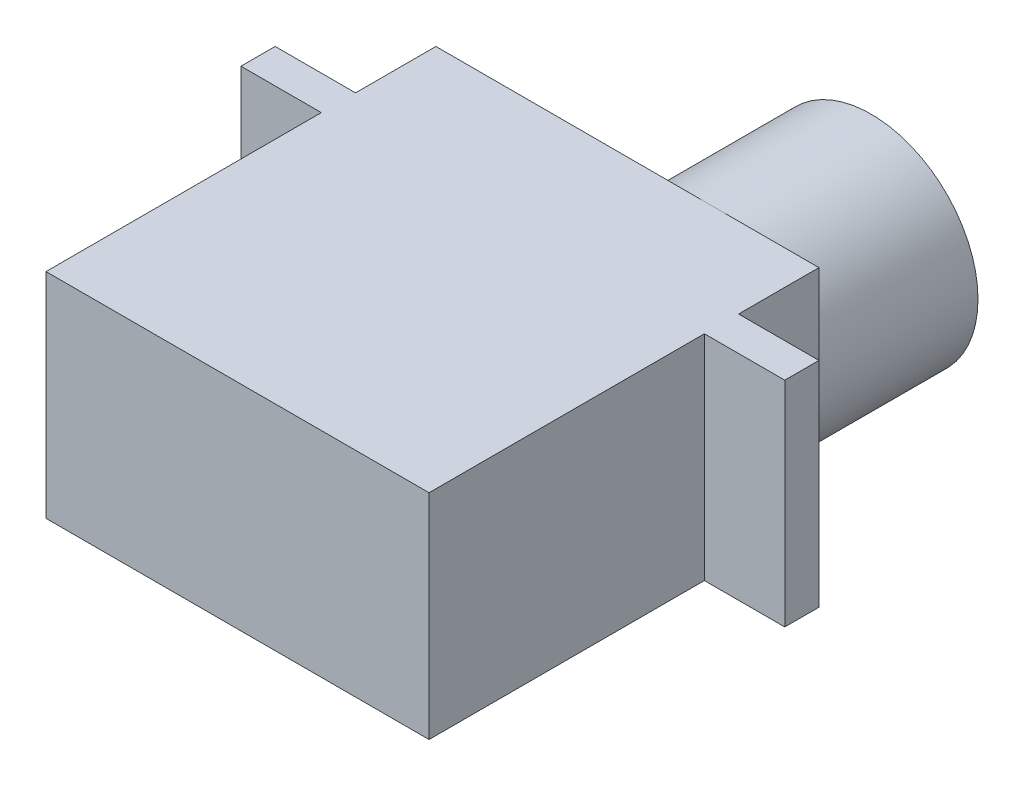
ISO-10303-21;
HEADER;
FILE_DESCRIPTION(('STEP AP214'),'2;1');
FILE_NAME('part.step','',(''),(''),'','','');
FILE_SCHEMA(('AUTOMOTIVE_DESIGN { 1 0 10303 214 1 1 1 1 }'));
ENDSEC;
DATA;
#1=APPLICATION_CONTEXT('core data for automotive mechanical design processes');
#2=APPLICATION_PROTOCOL_DEFINITION('international standard','automotive_design',2000,#1);
#3=PRODUCT_CONTEXT('',#1,'mechanical');
#4=PRODUCT('Part','Part','',(#3));
#5=PRODUCT_RELATED_PRODUCT_CATEGORY('part','',(#4));
#6=PRODUCT_DEFINITION_FORMATION('','',#4);
#7=PRODUCT_DEFINITION_CONTEXT('part definition',#1,'design');
#8=PRODUCT_DEFINITION('design','',#6,#7);
#9=PRODUCT_DEFINITION_SHAPE('','',#8);
#10=(LENGTH_UNIT() NAMED_UNIT(*) SI_UNIT(.MILLI.,.METRE.));
#11=(NAMED_UNIT(*) PLANE_ANGLE_UNIT() SI_UNIT($,.RADIAN.));
#12=(NAMED_UNIT(*) SI_UNIT($,.STERADIAN.) SOLID_ANGLE_UNIT());
#13=UNCERTAINTY_MEASURE_WITH_UNIT(LENGTH_MEASURE(1.E-05),#10,'distance_accuracy_value','');
#14=(GEOMETRIC_REPRESENTATION_CONTEXT(3) GLOBAL_UNCERTAINTY_ASSIGNED_CONTEXT((#13)) GLOBAL_UNIT_ASSIGNED_CONTEXT((#10,
#11,#12)) REPRESENTATION_CONTEXT('',''));
#15=CARTESIAN_POINT('',(0.,0.,0.));
#16=DIRECTION('',(0.,0.,1.));
#17=DIRECTION('',(1.,0.,0.));
#18=AXIS2_PLACEMENT_3D('',#15,#16,#17);
#19=CARTESIAN_POINT('',(0.,0.,-6.7));
#20=DIRECTION('',(0.,0.,-1.));
#21=DIRECTION('',(-1.,0.,0.));
#22=AXIS2_PLACEMENT_3D('',#19,#20,#21);
#23=PLANE('',#22);
#24=CARTESIAN_POINT('',(4.95,0.,-6.7));
#25=DIRECTION('',(0.,0.,-1.));
#26=DIRECTION('',(-1.,0.,0.));
#27=AXIS2_PLACEMENT_3D('',#24,#25,#26);
#28=CIRCLE('',#27,6.25);
#29=CARTESIAN_POINT('',(4.95,6.25,-6.7));
#30=VERTEX_POINT('',#29);
#31=CARTESIAN_POINT('',(11.2,0.,-6.7));
#32=VERTEX_POINT('',#31);
#33=EDGE_CURVE('E51',#30,#32,#28,.T.);
#34=ORIENTED_EDGE('',*,*,#33,.F.);
#35=DIRECTION('',(1.,0.,0.));
#36=VECTOR('',#35,1.);
#37=CARTESIAN_POINT('',(-11.2,6.25,-6.7));
#38=LINE('',#37,#36);
#39=CARTESIAN_POINT('',(11.2,6.25,-6.7));
#40=VERTEX_POINT('',#39);
#41=EDGE_CURVE('E147',#30,#40,#38,.T.);
#42=ORIENTED_EDGE('',*,*,#41,.T.);
#43=DIRECTION('',(0.,-1.,0.));
#44=VECTOR('',#43,1.);
#45=CARTESIAN_POINT('',(11.2,6.25,-6.7));
#46=LINE('',#45,#44);
#47=EDGE_CURVE('E162',#40,#32,#46,.T.);
#48=ORIENTED_EDGE('',*,*,#47,.T.);
#49=EDGE_LOOP('',(#34,#42,#48));
#50=FACE_BOUND('',#49,.T.);
#51=ADVANCED_FACE('F39',(#50),#23,.T.);
#52=CARTESIAN_POINT('',(4.95,-6.25,-6.7));
#53=VERTEX_POINT('',#52);
#54=EDGE_CURVE('E11',#32,#53,#28,.T.);
#55=ORIENTED_EDGE('',*,*,#54,.F.);
#56=CARTESIAN_POINT('',(11.2,-6.25,-6.7));
#57=VERTEX_POINT('',#56);
#58=EDGE_CURVE('E146',#32,#57,#46,.T.);
#59=ORIENTED_EDGE('',*,*,#58,.T.);
#60=DIRECTION('',(-1.,0.,0.));
#61=VECTOR('',#60,1.);
#62=CARTESIAN_POINT('',(11.2,-6.25,-6.7));
#63=LINE('',#62,#61);
#64=EDGE_CURVE('E178',#57,#53,#63,.T.);
#65=ORIENTED_EDGE('',*,*,#64,.T.);
#66=EDGE_LOOP('',(#55,#59,#65));
#67=FACE_BOUND('',#66,.T.);
#68=ADVANCED_FACE('F320',(#67),#23,.T.);
#69=CARTESIAN_POINT('',(0.,0.,-2.));
#70=DIRECTION('',(0.,0.,1.));
#71=DIRECTION('',(1.,0.,0.));
#72=AXIS2_PLACEMENT_3D('',#69,#70,#71);
#73=PLANE('',#72);
#74=DIRECTION('',(0.,1.,0.));
#75=VECTOR('',#74,1.);
#76=CARTESIAN_POINT('',(-11.2,-6.25,-2.));
#77=LINE('',#76,#75);
#78=CARTESIAN_POINT('',(-11.2,-6.25,-2.));
#79=VERTEX_POINT('',#78);
#80=CARTESIAN_POINT('',(-11.2,6.25,-2.));
#81=VERTEX_POINT('',#80);
#82=EDGE_CURVE('E160',#79,#81,#77,.T.);
#83=ORIENTED_EDGE('',*,*,#82,.F.);
#84=DIRECTION('',(-1.,0.,0.));
#85=VECTOR('',#84,1.);
#86=CARTESIAN_POINT('',(-15.9,-6.25,-2.));
#87=LINE('',#86,#85);
#88=CARTESIAN_POINT('',(-15.9,-6.25,-2.));
#89=VERTEX_POINT('',#88);
#90=EDGE_CURVE('E208',#79,#89,#87,.T.);
#91=ORIENTED_EDGE('',*,*,#90,.T.);
#92=DIRECTION('',(0.,1.,0.));
#93=VECTOR('',#92,1.);
#94=CARTESIAN_POINT('',(-15.9,6.25,-2.));
#95=LINE('',#94,#93);
#96=CARTESIAN_POINT('',(-15.9,6.25,-2.));
#97=VERTEX_POINT('',#96);
#98=EDGE_CURVE('E213',#89,#97,#95,.T.);
#99=ORIENTED_EDGE('',*,*,#98,.T.);
#100=DIRECTION('',(1.,0.,0.));
#101=VECTOR('',#100,1.);
#102=CARTESIAN_POINT('',(-15.9,6.25,-2.));
#103=LINE('',#102,#101);
#104=EDGE_CURVE('E217',#97,#81,#103,.T.);
#105=ORIENTED_EDGE('',*,*,#104,.T.);
#106=EDGE_LOOP('',(#83,#91,#99,#105));
#107=FACE_BOUND('',#106,.T.);
#108=ADVANCED_FACE('F325',(#107),#73,.F.);
#109=DIRECTION('',(0.,-1.,0.));
#110=VECTOR('',#109,1.);
#111=CARTESIAN_POINT('',(11.2,6.25,-2.));
#112=LINE('',#111,#110);
#113=CARTESIAN_POINT('',(11.2,6.25,-2.));
#114=VERTEX_POINT('',#113);
#115=CARTESIAN_POINT('',(11.2,-6.25,-2.));
#116=VERTEX_POINT('',#115);
#117=EDGE_CURVE('E184',#114,#116,#112,.T.);
#118=ORIENTED_EDGE('',*,*,#117,.F.);
#119=CARTESIAN_POINT('',(15.9,6.25,-2.));
#120=VERTEX_POINT('',#119);
#121=EDGE_CURVE('E216',#114,#120,#103,.T.);
#122=ORIENTED_EDGE('',*,*,#121,.T.);
#123=DIRECTION('',(0.,-1.,0.));
#124=VECTOR('',#123,1.);
#125=CARTESIAN_POINT('',(15.9,6.25,-2.));
#126=LINE('',#125,#124);
#127=CARTESIAN_POINT('',(15.9,-6.25,-2.));
#128=VERTEX_POINT('',#127);
#129=EDGE_CURVE('E204',#120,#128,#126,.T.);
#130=ORIENTED_EDGE('',*,*,#129,.T.);
#131=EDGE_CURVE('E210',#128,#116,#87,.T.);
#132=ORIENTED_EDGE('',*,*,#131,.T.);
#133=EDGE_LOOP('',(#118,#122,#130,#132));
#134=FACE_BOUND('',#133,.T.);
#135=ADVANCED_FACE('F337',(#134),#73,.F.);
#136=CARTESIAN_POINT('',(-11.2,-6.25,16.1));
#137=DIRECTION('',(-1.,0.,0.));
#138=DIRECTION('',(0.,0.,1.));
#139=AXIS2_PLACEMENT_3D('',#136,#137,#138);
#140=PLANE('',#139);
#141=DIRECTION('',(0.,1.,0.));
#142=VECTOR('',#141,1.);
#143=CARTESIAN_POINT('',(-11.2,-6.25,0.));
#144=LINE('',#143,#142);
#145=CARTESIAN_POINT('',(-11.2,-6.25,0.));
#146=VERTEX_POINT('',#145);
#147=CARTESIAN_POINT('',(-11.2,6.25,0.));
#148=VERTEX_POINT('',#147);
#149=EDGE_CURVE('E251',#146,#148,#144,.T.);
#150=ORIENTED_EDGE('',*,*,#149,.F.);
#151=DIRECTION('',(0.,0.,-1.));
#152=VECTOR('',#151,1.);
#153=CARTESIAN_POINT('',(-11.2,-6.25,16.1));
#154=LINE('',#153,#152);
#155=CARTESIAN_POINT('',(-11.2,-6.25,16.1));
#156=VERTEX_POINT('',#155);
#157=EDGE_CURVE('E168',#156,#146,#154,.T.);
#158=ORIENTED_EDGE('',*,*,#157,.F.);
#159=DIRECTION('',(0.,1.,0.));
#160=VECTOR('',#159,1.);
#161=CARTESIAN_POINT('',(-11.2,-6.25,16.1));
#162=LINE('',#161,#160);
#163=CARTESIAN_POINT('',(-11.2,6.25,16.1));
#164=VERTEX_POINT('',#163);
#165=EDGE_CURVE('E252',#156,#164,#162,.T.);
#166=ORIENTED_EDGE('',*,*,#165,.T.);
#167=DIRECTION('',(0.,0.,-1.));
#168=VECTOR('',#167,1.);
#169=CARTESIAN_POINT('',(-11.2,6.25,16.1));
#170=LINE('',#169,#168);
#171=EDGE_CURVE('E43',#164,#148,#170,.T.);
#172=ORIENTED_EDGE('',*,*,#171,.T.);
#173=EDGE_LOOP('',(#150,#158,#166,#172));
#174=FACE_BOUND('',#173,.T.);
#175=ADVANCED_FACE('F41',(#174),#140,.T.);
#176=CARTESIAN_POINT('',(-11.2,-6.25,16.1));
#177=DIRECTION('',(0.,1.,0.));
#178=DIRECTION('',(0.,0.,1.));
#179=AXIS2_PLACEMENT_3D('',#176,#177,#178);
#180=PLANE('',#179);
#181=ORIENTED_EDGE('',*,*,#157,.T.);
#182=DIRECTION('',(-1.,0.,0.));
#183=VECTOR('',#182,1.);
#184=CARTESIAN_POINT('',(-15.9,-6.25,0.));
#185=LINE('',#184,#183);
#186=CARTESIAN_POINT('',(-15.9,-6.25,0.));
#187=VERTEX_POINT('',#186);
#188=EDGE_CURVE('E224',#146,#187,#185,.T.);
#189=ORIENTED_EDGE('',*,*,#188,.T.);
#190=DIRECTION('',(0.,0.,1.));
#191=VECTOR('',#190,1.);
#192=CARTESIAN_POINT('',(-15.9,-6.25,-2.));
#193=LINE('',#192,#191);
#194=EDGE_CURVE('E243',#89,#187,#193,.T.);
#195=ORIENTED_EDGE('',*,*,#194,.F.);
#196=ORIENTED_EDGE('',*,*,#90,.F.);
#197=DIRECTION('',(0.,0.,1.));
#198=VECTOR('',#197,1.);
#199=CARTESIAN_POINT('',(-11.2,-6.25,-6.7));
#200=LINE('',#199,#198);
#201=CARTESIAN_POINT('',(-11.2,-6.25,-6.7));
#202=VERTEX_POINT('',#201);
#203=EDGE_CURVE('E193',#202,#79,#200,.T.);
#204=ORIENTED_EDGE('',*,*,#203,.F.);
#205=EDGE_CURVE('E177',#53,#202,#63,.T.);
#206=ORIENTED_EDGE('',*,*,#205,.F.);
#207=ORIENTED_EDGE('',*,*,#64,.F.);
#208=DIRECTION('',(0.,0.,1.));
#209=VECTOR('',#208,1.);
#210=CARTESIAN_POINT('',(11.2,-6.25,-6.7));
#211=LINE('',#210,#209);
#212=EDGE_CURVE('E197',#57,#116,#211,.T.);
#213=ORIENTED_EDGE('',*,*,#212,.T.);
#214=ORIENTED_EDGE('',*,*,#131,.F.);
#215=DIRECTION('',(0.,0.,1.));
#216=VECTOR('',#215,1.);
#217=CARTESIAN_POINT('',(15.9,-6.25,-2.));
#218=LINE('',#217,#216);
#219=CARTESIAN_POINT('',(15.9,-6.25,0.));
#220=VERTEX_POINT('',#219);
#221=EDGE_CURVE('E247',#128,#220,#218,.T.);
#222=ORIENTED_EDGE('',*,*,#221,.T.);
#223=CARTESIAN_POINT('',(11.2,-6.25,0.));
#224=VERTEX_POINT('',#223);
#225=EDGE_CURVE('E225',#220,#224,#185,.T.);
#226=ORIENTED_EDGE('',*,*,#225,.T.);
#227=DIRECTION('',(0.,0.,-1.));
#228=VECTOR('',#227,1.);
#229=CARTESIAN_POINT('',(11.2,-6.25,16.1));
#230=LINE('',#229,#228);
#231=CARTESIAN_POINT('',(11.2,-6.25,16.1));
#232=VERTEX_POINT('',#231);
#233=EDGE_CURVE('E171',#232,#224,#230,.T.);
#234=ORIENTED_EDGE('',*,*,#233,.F.);
#235=DIRECTION('',(1.,0.,0.));
#236=VECTOR('',#235,1.);
#237=CARTESIAN_POINT('',(-11.2,-6.25,16.1));
#238=LINE('',#237,#236);
#239=EDGE_CURVE('E264',#156,#232,#238,.T.);
#240=ORIENTED_EDGE('',*,*,#239,.F.);
#241=EDGE_LOOP('',(#181,#189,#195,#196,#204,#206,#207,#213,#214,#222,#226,#234,#240));
#242=FACE_BOUND('',#241,.T.);
#243=ADVANCED_FACE('F295',(#242),#180,.F.);
#244=CARTESIAN_POINT('',(11.2,-6.25,16.1));
#245=DIRECTION('',(-1.,0.,0.));
#246=DIRECTION('',(0.,0.,1.));
#247=AXIS2_PLACEMENT_3D('',#244,#245,#246);
#248=PLANE('',#247);
#249=DIRECTION('',(0.,1.,0.));
#250=VECTOR('',#249,1.);
#251=CARTESIAN_POINT('',(11.2,-6.25,0.));
#252=LINE('',#251,#250);
#253=CARTESIAN_POINT('',(11.2,6.25,0.));
#254=VERTEX_POINT('',#253);
#255=EDGE_CURVE('E257',#224,#254,#252,.T.);
#256=ORIENTED_EDGE('',*,*,#255,.T.);
#257=DIRECTION('',(0.,0.,-1.));
#258=VECTOR('',#257,1.);
#259=CARTESIAN_POINT('',(11.2,6.25,16.1));
#260=LINE('',#259,#258);
#261=CARTESIAN_POINT('',(11.2,6.25,16.1));
#262=VERTEX_POINT('',#261);
#263=EDGE_CURVE('E274',#262,#254,#260,.T.);
#264=ORIENTED_EDGE('',*,*,#263,.F.);
#265=DIRECTION('',(0.,1.,0.));
#266=VECTOR('',#265,1.);
#267=CARTESIAN_POINT('',(11.2,-6.25,16.1));
#268=LINE('',#267,#266);
#269=EDGE_CURVE('E261',#232,#262,#268,.T.);
#270=ORIENTED_EDGE('',*,*,#269,.F.);
#271=ORIENTED_EDGE('',*,*,#233,.T.);
#272=EDGE_LOOP('',(#256,#264,#270,#271));
#273=FACE_BOUND('',#272,.T.);
#274=ADVANCED_FACE('F290',(#273),#248,.F.);
#275=CARTESIAN_POINT('',(-11.2,6.25,16.1));
#276=DIRECTION('',(0.,1.,0.));
#277=DIRECTION('',(0.,0.,1.));
#278=AXIS2_PLACEMENT_3D('',#275,#276,#277);
#279=PLANE('',#278);
#280=ORIENTED_EDGE('',*,*,#263,.T.);
#281=DIRECTION('',(1.,0.,0.));
#282=VECTOR('',#281,1.);
#283=CARTESIAN_POINT('',(-15.9,6.25,0.));
#284=LINE('',#283,#282);
#285=CARTESIAN_POINT('',(15.9,6.25,0.));
#286=VERTEX_POINT('',#285);
#287=EDGE_CURVE('E232',#254,#286,#284,.T.);
#288=ORIENTED_EDGE('',*,*,#287,.T.);
#289=DIRECTION('',(0.,0.,1.));
#290=VECTOR('',#289,1.);
#291=CARTESIAN_POINT('',(15.9,6.25,-2.));
#292=LINE('',#291,#290);
#293=EDGE_CURVE('E220',#120,#286,#292,.T.);
#294=ORIENTED_EDGE('',*,*,#293,.F.);
#295=ORIENTED_EDGE('',*,*,#121,.F.);
#296=DIRECTION('',(0.,0.,1.));
#297=VECTOR('',#296,1.);
#298=CARTESIAN_POINT('',(11.2,6.25,-6.7));
#299=LINE('',#298,#297);
#300=EDGE_CURVE('E155',#40,#114,#299,.T.);
#301=ORIENTED_EDGE('',*,*,#300,.F.);
#302=ORIENTED_EDGE('',*,*,#41,.F.);
#303=CARTESIAN_POINT('',(-11.2,6.25,-6.7));
#304=VERTEX_POINT('',#303);
#305=EDGE_CURVE('E137',#304,#30,#38,.T.);
#306=ORIENTED_EDGE('',*,*,#305,.F.);
#307=DIRECTION('',(0.,0.,1.));
#308=VECTOR('',#307,1.);
#309=CARTESIAN_POINT('',(-11.2,6.25,-6.7));
#310=LINE('',#309,#308);
#311=EDGE_CURVE('E183',#304,#81,#310,.T.);
#312=ORIENTED_EDGE('',*,*,#311,.T.);
#313=ORIENTED_EDGE('',*,*,#104,.F.);
#314=DIRECTION('',(0.,0.,1.));
#315=VECTOR('',#314,1.);
#316=CARTESIAN_POINT('',(-15.9,6.25,-2.));
#317=LINE('',#316,#315);
#318=CARTESIAN_POINT('',(-15.9,6.25,0.));
#319=VERTEX_POINT('',#318);
#320=EDGE_CURVE('E239',#97,#319,#317,.T.);
#321=ORIENTED_EDGE('',*,*,#320,.T.);
#322=EDGE_CURVE('E209',#319,#148,#284,.T.);
#323=ORIENTED_EDGE('',*,*,#322,.T.);
#324=ORIENTED_EDGE('',*,*,#171,.F.);
#325=DIRECTION('',(1.,0.,0.));
#326=VECTOR('',#325,1.);
#327=CARTESIAN_POINT('',(-11.2,6.25,16.1));
#328=LINE('',#327,#326);
#329=EDGE_CURVE('E256',#164,#262,#328,.T.);
#330=ORIENTED_EDGE('',*,*,#329,.T.);
#331=EDGE_LOOP('',(#280,#288,#294,#295,#301,#302,#306,#312,#313,#321,#323,#324,#330));
#332=FACE_BOUND('',#331,.T.);
#333=ADVANCED_FACE('F152',(#332),#279,.T.);
#334=CARTESIAN_POINT('',(0.,0.,16.1));
#335=DIRECTION('',(0.,0.,-1.));
#336=DIRECTION('',(-1.,0.,0.));
#337=AXIS2_PLACEMENT_3D('',#334,#335,#336);
#338=PLANE('',#337);
#339=ORIENTED_EDGE('',*,*,#165,.F.);
#340=ORIENTED_EDGE('',*,*,#239,.T.);
#341=ORIENTED_EDGE('',*,*,#269,.T.);
#342=ORIENTED_EDGE('',*,*,#329,.F.);
#343=EDGE_LOOP('',(#339,#340,#341,#342));
#344=FACE_BOUND('',#343,.T.);
#345=ADVANCED_FACE('F285',(#344),#338,.F.);
#346=CARTESIAN_POINT('',(0.,0.,0.));
#347=DIRECTION('',(0.,0.,1.));
#348=DIRECTION('',(1.,0.,0.));
#349=AXIS2_PLACEMENT_3D('',#346,#347,#348);
#350=PLANE('',#349);
#351=ORIENTED_EDGE('',*,*,#255,.F.);
#352=ORIENTED_EDGE('',*,*,#225,.F.);
#353=DIRECTION('',(0.,-1.,0.));
#354=VECTOR('',#353,1.);
#355=CARTESIAN_POINT('',(15.9,6.25,0.));
#356=LINE('',#355,#354);
#357=EDGE_CURVE('E203',#286,#220,#356,.T.);
#358=ORIENTED_EDGE('',*,*,#357,.F.);
#359=ORIENTED_EDGE('',*,*,#287,.F.);
#360=EDGE_LOOP('',(#351,#352,#358,#359));
#361=FACE_BOUND('',#360,.T.);
#362=ADVANCED_FACE('F292',(#361),#350,.T.);
#363=CARTESIAN_POINT('',(15.9,6.25,-2.));
#364=DIRECTION('',(-1.,0.,0.));
#365=DIRECTION('',(0.,-1.,0.));
#366=AXIS2_PLACEMENT_3D('',#363,#364,#365);
#367=PLANE('',#366);
#368=ORIENTED_EDGE('',*,*,#357,.T.);
#369=ORIENTED_EDGE('',*,*,#221,.F.);
#370=ORIENTED_EDGE('',*,*,#129,.F.);
#371=ORIENTED_EDGE('',*,*,#293,.T.);
#372=EDGE_LOOP('',(#368,#369,#370,#371));
#373=FACE_BOUND('',#372,.T.);
#374=ADVANCED_FACE('F299',(#373),#367,.F.);
#375=CARTESIAN_POINT('',(-15.9,6.25,-2.));
#376=DIRECTION('',(1.,0.,0.));
#377=DIRECTION('',(0.,1.,0.));
#378=AXIS2_PLACEMENT_3D('',#375,#376,#377);
#379=PLANE('',#378);
#380=DIRECTION('',(0.,1.,0.));
#381=VECTOR('',#380,1.);
#382=CARTESIAN_POINT('',(-15.9,6.25,0.));
#383=LINE('',#382,#381);
#384=EDGE_CURVE('E229',#187,#319,#383,.T.);
#385=ORIENTED_EDGE('',*,*,#384,.T.);
#386=ORIENTED_EDGE('',*,*,#320,.F.);
#387=ORIENTED_EDGE('',*,*,#98,.F.);
#388=ORIENTED_EDGE('',*,*,#194,.T.);
#389=EDGE_LOOP('',(#385,#386,#387,#388));
#390=FACE_BOUND('',#389,.T.);
#391=ADVANCED_FACE('F341',(#390),#379,.F.);
#392=ORIENTED_EDGE('',*,*,#188,.F.);
#393=ORIENTED_EDGE('',*,*,#149,.T.);
#394=ORIENTED_EDGE('',*,*,#322,.F.);
#395=ORIENTED_EDGE('',*,*,#384,.F.);
#396=EDGE_LOOP('',(#392,#393,#394,#395));
#397=FACE_BOUND('',#396,.T.);
#398=ADVANCED_FACE('F333',(#397),#350,.T.);
#399=CARTESIAN_POINT('',(11.2,6.25,-6.7));
#400=DIRECTION('',(-1.,0.,0.));
#401=DIRECTION('',(0.,0.,1.));
#402=AXIS2_PLACEMENT_3D('',#399,#400,#401);
#403=PLANE('',#402);
#404=ORIENTED_EDGE('',*,*,#117,.T.);
#405=ORIENTED_EDGE('',*,*,#212,.F.);
#406=ORIENTED_EDGE('',*,*,#58,.F.);
#407=ORIENTED_EDGE('',*,*,#47,.F.);
#408=ORIENTED_EDGE('',*,*,#300,.T.);
#409=EDGE_LOOP('',(#404,#405,#406,#407,#408));
#410=FACE_BOUND('',#409,.T.);
#411=ADVANCED_FACE('F329',(#410),#403,.F.);
#412=CARTESIAN_POINT('',(-11.2,-6.25,-6.7));
#413=DIRECTION('',(1.,0.,0.));
#414=DIRECTION('',(0.,0.,-1.));
#415=AXIS2_PLACEMENT_3D('',#412,#413,#414);
#416=PLANE('',#415);
#417=ORIENTED_EDGE('',*,*,#82,.T.);
#418=ORIENTED_EDGE('',*,*,#311,.F.);
#419=DIRECTION('',(0.,1.,0.));
#420=VECTOR('',#419,1.);
#421=CARTESIAN_POINT('',(-11.2,-6.25,-6.7));
#422=LINE('',#421,#420);
#423=EDGE_CURVE('E141',#202,#304,#422,.T.);
#424=ORIENTED_EDGE('',*,*,#423,.F.);
#425=ORIENTED_EDGE('',*,*,#203,.T.);
#426=EDGE_LOOP('',(#417,#418,#424,#425));
#427=FACE_BOUND('',#426,.T.);
#428=ADVANCED_FACE('F318',(#427),#416,.F.);
#429=EDGE_CURVE('E49',#53,#30,#28,.T.);
#430=ORIENTED_EDGE('',*,*,#429,.F.);
#431=ORIENTED_EDGE('',*,*,#205,.T.);
#432=ORIENTED_EDGE('',*,*,#423,.T.);
#433=ORIENTED_EDGE('',*,*,#305,.T.);
#434=EDGE_LOOP('',(#430,#431,#432,#433));
#435=FACE_BOUND('',#434,.T.);
#436=ADVANCED_FACE('F139',(#435),#23,.T.);
#437=CARTESIAN_POINT('',(4.95,0.,-16.));
#438=DIRECTION('',(0.,0.,1.));
#439=DIRECTION('',(1.,0.,0.));
#440=AXIS2_PLACEMENT_3D('',#437,#438,#439);
#441=CYLINDRICAL_SURFACE('',#440,6.25);
#442=CARTESIAN_POINT('',(4.95,0.,-16.));
#443=DIRECTION('',(0.,0.,-1.));
#444=DIRECTION('',(-1.,0.,0.));
#445=AXIS2_PLACEMENT_3D('',#442,#443,#444);
#446=CIRCLE('',#445,6.25);
#447=CARTESIAN_POINT('',(-1.3,0.,-16.));
#448=VERTEX_POINT('',#447);
#449=EDGE_CURVE('E165',#448,#448,#446,.T.);
#450=ORIENTED_EDGE('',*,*,#449,.F.);
#451=EDGE_LOOP('',(#450));
#452=FACE_BOUND('',#451,.T.);
#453=ORIENTED_EDGE('',*,*,#33,.T.);
#454=ORIENTED_EDGE('',*,*,#54,.T.);
#455=ORIENTED_EDGE('',*,*,#429,.T.);
#456=EDGE_LOOP('',(#453,#454,#455));
#457=FACE_BOUND('',#456,.T.);
#458=ADVANCED_FACE('F166',(#452,#457),#441,.T.);
#459=CARTESIAN_POINT('',(4.95,0.,-16.));
#460=DIRECTION('',(0.,0.,-1.));
#461=DIRECTION('',(-1.,0.,0.));
#462=AXIS2_PLACEMENT_3D('',#459,#460,#461);
#463=PLANE('',#462);
#464=ORIENTED_EDGE('',*,*,#449,.T.);
#465=EDGE_LOOP('',(#464));
#466=FACE_BOUND('',#465,.T.);
#467=ADVANCED_FACE('F309',(#466),#463,.T.);
#468=CLOSED_SHELL('',(#51,#68,#108,#135,#175,#243,#274,#333,#345,#362,#374,#391,#398,#411,#428,
#436,#458,#467));
#469=MANIFOLD_SOLID_BREP('B2',#468);
#470=ADVANCED_BREP_SHAPE_REPRESENTATION('',(#18,#469),#14);
#471=SHAPE_DEFINITION_REPRESENTATION(#9,#470);
ENDSEC;
END-ISO-10303-21;
